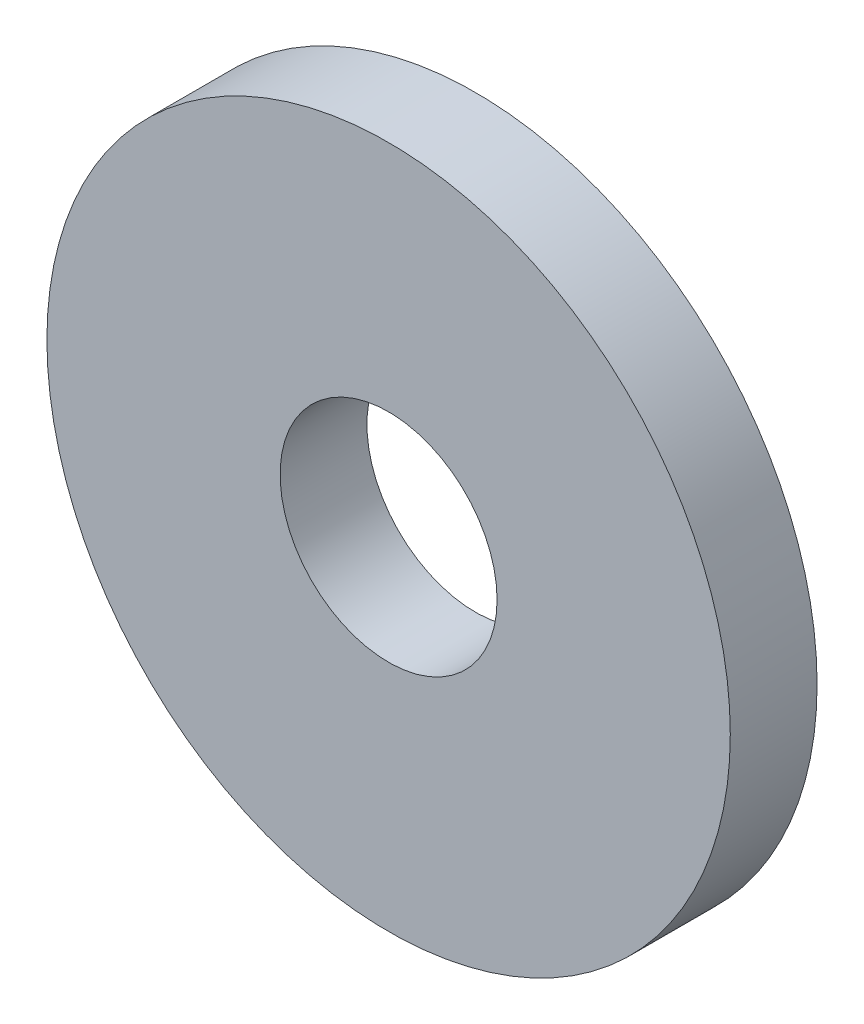
ISO-10303-21;
HEADER;
FILE_DESCRIPTION(('STEP AP214'),'2;1');
FILE_NAME('part.step','',(''),(''),'','','');
FILE_SCHEMA(('AUTOMOTIVE_DESIGN { 1 0 10303 214 1 1 1 1 }'));
ENDSEC;
DATA;
#1=APPLICATION_CONTEXT('core data for automotive mechanical design processes');
#2=APPLICATION_PROTOCOL_DEFINITION('international standard','automotive_design',2000,#1);
#3=PRODUCT_CONTEXT('',#1,'mechanical');
#4=PRODUCT('Part','Part','',(#3));
#5=PRODUCT_RELATED_PRODUCT_CATEGORY('part','',(#4));
#6=PRODUCT_DEFINITION_FORMATION('','',#4);
#7=PRODUCT_DEFINITION_CONTEXT('part definition',#1,'design');
#8=PRODUCT_DEFINITION('design','',#6,#7);
#9=PRODUCT_DEFINITION_SHAPE('','',#8);
#10=(LENGTH_UNIT() NAMED_UNIT(*) SI_UNIT(.MILLI.,.METRE.));
#11=(NAMED_UNIT(*) PLANE_ANGLE_UNIT() SI_UNIT($,.RADIAN.));
#12=(NAMED_UNIT(*) SI_UNIT($,.STERADIAN.) SOLID_ANGLE_UNIT());
#13=UNCERTAINTY_MEASURE_WITH_UNIT(LENGTH_MEASURE(1.E-05),#10,'distance_accuracy_value','');
#14=(GEOMETRIC_REPRESENTATION_CONTEXT(3) GLOBAL_UNCERTAINTY_ASSIGNED_CONTEXT((#13)) GLOBAL_UNIT_ASSIGNED_CONTEXT((#10,
#11,#12)) REPRESENTATION_CONTEXT('',''));
#15=CARTESIAN_POINT('',(0.,0.,0.));
#16=DIRECTION('',(0.,0.,1.));
#17=DIRECTION('',(1.,0.,0.));
#18=AXIS2_PLACEMENT_3D('',#15,#16,#17);
#19=CARTESIAN_POINT('',(0.,0.,6.35));
#20=DIRECTION('',(0.,0.,1.));
#21=DIRECTION('',(1.,0.,0.));
#22=AXIS2_PLACEMENT_3D('',#19,#20,#21);
#23=PLANE('',#22);
#24=CARTESIAN_POINT('',(0.,0.,6.35));
#25=DIRECTION('',(0.,0.,1.));
#26=DIRECTION('',(1.,0.,0.));
#27=AXIS2_PLACEMENT_3D('',#24,#25,#26);
#28=CIRCLE('',#27,25.);
#29=CARTESIAN_POINT('',(25.,0.,6.35));
#30=VERTEX_POINT('',#29);
#31=EDGE_CURVE('E10',#30,#30,#28,.T.);
#32=ORIENTED_EDGE('',*,*,#31,.T.);
#33=EDGE_LOOP('',(#32));
#34=FACE_BOUND('',#33,.T.);
#35=CARTESIAN_POINT('',(0.,0.,6.35));
#36=DIRECTION('',(0.,0.,1.));
#37=DIRECTION('',(1.,0.,0.));
#38=AXIS2_PLACEMENT_3D('',#35,#36,#37);
#39=CIRCLE('',#38,7.9375);
#40=CARTESIAN_POINT('',(7.9375,0.,6.35));
#41=VERTEX_POINT('',#40);
#42=EDGE_CURVE('E42',#41,#41,#39,.T.);
#43=ORIENTED_EDGE('',*,*,#42,.F.);
#44=EDGE_LOOP('',(#43));
#45=FACE_BOUND('',#44,.T.);
#46=ADVANCED_FACE('F31',(#34,#45),#23,.T.);
#47=CARTESIAN_POINT('',(0.,0.,0.));
#48=DIRECTION('',(0.,0.,1.));
#49=DIRECTION('',(1.,0.,0.));
#50=AXIS2_PLACEMENT_3D('',#47,#48,#49);
#51=PLANE('',#50);
#52=CARTESIAN_POINT('',(0.,0.,0.));
#53=DIRECTION('',(0.,0.,1.));
#54=DIRECTION('',(1.,0.,0.));
#55=AXIS2_PLACEMENT_3D('',#52,#53,#54);
#56=CIRCLE('',#55,25.);
#57=CARTESIAN_POINT('',(25.,0.,0.));
#58=VERTEX_POINT('',#57);
#59=EDGE_CURVE('E35',#58,#58,#56,.T.);
#60=ORIENTED_EDGE('',*,*,#59,.F.);
#61=EDGE_LOOP('',(#60));
#62=FACE_BOUND('',#61,.T.);
#63=CARTESIAN_POINT('',(0.,0.,0.));
#64=DIRECTION('',(0.,0.,1.));
#65=DIRECTION('',(1.,0.,0.));
#66=AXIS2_PLACEMENT_3D('',#63,#64,#65);
#67=CIRCLE('',#66,7.9375);
#68=CARTESIAN_POINT('',(7.9375,0.,0.));
#69=VERTEX_POINT('',#68);
#70=EDGE_CURVE('E44',#69,#69,#67,.T.);
#71=ORIENTED_EDGE('',*,*,#70,.T.);
#72=EDGE_LOOP('',(#71));
#73=FACE_BOUND('',#72,.T.);
#74=ADVANCED_FACE('F54',(#62,#73),#51,.F.);
#75=CARTESIAN_POINT('',(0.,0.,6.35));
#76=DIRECTION('',(0.,0.,-1.));
#77=DIRECTION('',(-1.,0.,0.));
#78=AXIS2_PLACEMENT_3D('',#75,#76,#77);
#79=CYLINDRICAL_SURFACE('',#78,25.);
#80=ORIENTED_EDGE('',*,*,#31,.F.);
#81=EDGE_LOOP('',(#80));
#82=FACE_BOUND('',#81,.T.);
#83=ORIENTED_EDGE('',*,*,#59,.T.);
#84=EDGE_LOOP('',(#83));
#85=FACE_BOUND('',#84,.T.);
#86=ADVANCED_FACE('F33',(#82,#85),#79,.T.);
#87=CARTESIAN_POINT('',(0.,0.,6.35));
#88=DIRECTION('',(0.,0.,-1.));
#89=DIRECTION('',(-1.,0.,0.));
#90=AXIS2_PLACEMENT_3D('',#87,#88,#89);
#91=CYLINDRICAL_SURFACE('',#90,7.9375);
#92=ORIENTED_EDGE('',*,*,#42,.T.);
#93=EDGE_LOOP('',(#92));
#94=FACE_BOUND('',#93,.T.);
#95=ORIENTED_EDGE('',*,*,#70,.F.);
#96=EDGE_LOOP('',(#95));
#97=FACE_BOUND('',#96,.T.);
#98=ADVANCED_FACE('F50',(#94,#97),#91,.F.);
#99=CLOSED_SHELL('',(#46,#74,#86,#98));
#100=MANIFOLD_SOLID_BREP('B2',#99);
#101=ADVANCED_BREP_SHAPE_REPRESENTATION('',(#18,#100),#14);
#102=SHAPE_DEFINITION_REPRESENTATION(#9,#101);
ENDSEC;
END-ISO-10303-21;
